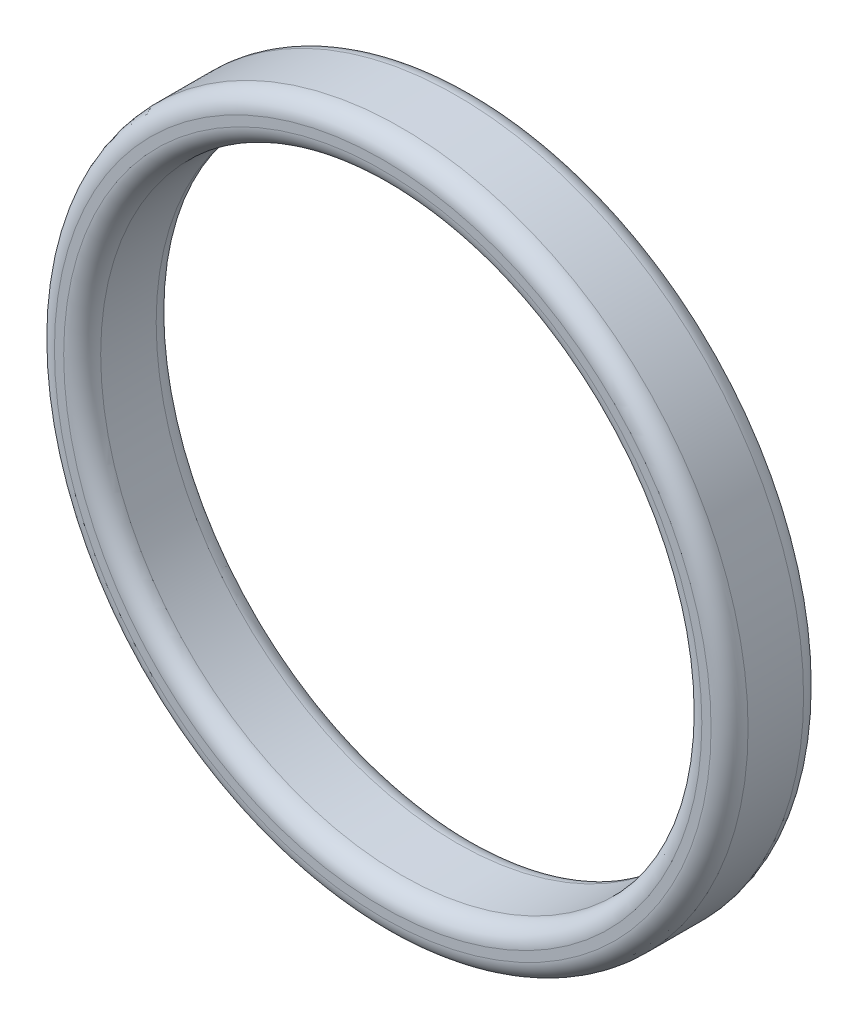
ISO-10303-21;
HEADER;
FILE_DESCRIPTION(('STEP AP214'),'2;1');
FILE_NAME('part.step','',(''),(''),'','','');
FILE_SCHEMA(('AUTOMOTIVE_DESIGN { 1 0 10303 214 1 1 1 1 }'));
ENDSEC;
DATA;
#1=APPLICATION_CONTEXT('core data for automotive mechanical design processes');
#2=APPLICATION_PROTOCOL_DEFINITION('international standard','automotive_design',2000,#1);
#3=PRODUCT_CONTEXT('',#1,'mechanical');
#4=PRODUCT('Part','Part','',(#3));
#5=PRODUCT_RELATED_PRODUCT_CATEGORY('part','',(#4));
#6=PRODUCT_DEFINITION_FORMATION('','',#4);
#7=PRODUCT_DEFINITION_CONTEXT('part definition',#1,'design');
#8=PRODUCT_DEFINITION('design','',#6,#7);
#9=PRODUCT_DEFINITION_SHAPE('','',#8);
#10=(LENGTH_UNIT() NAMED_UNIT(*) SI_UNIT(.MILLI.,.METRE.));
#11=(NAMED_UNIT(*) PLANE_ANGLE_UNIT() SI_UNIT($,.RADIAN.));
#12=(NAMED_UNIT(*) SI_UNIT($,.STERADIAN.) SOLID_ANGLE_UNIT());
#13=UNCERTAINTY_MEASURE_WITH_UNIT(LENGTH_MEASURE(1.E-05),#10,'distance_accuracy_value','');
#14=(GEOMETRIC_REPRESENTATION_CONTEXT(3) GLOBAL_UNCERTAINTY_ASSIGNED_CONTEXT((#13)) GLOBAL_UNIT_ASSIGNED_CONTEXT((#10,
#11,#12)) REPRESENTATION_CONTEXT('',''));
#15=CARTESIAN_POINT('',(0.,0.,0.));
#16=DIRECTION('',(0.,0.,1.));
#17=DIRECTION('',(1.,0.,0.));
#18=AXIS2_PLACEMENT_3D('',#15,#16,#17);
#19=CARTESIAN_POINT('',(0.,0.,0.02));
#20=DIRECTION('',(0.,0.,1.));
#21=DIRECTION('',(1.,0.,0.));
#22=AXIS2_PLACEMENT_3D('',#19,#20,#21);
#23=PLANE('',#22);
#24=CARTESIAN_POINT('',(0.,0.,0.02));
#25=DIRECTION('',(0.,0.,1.));
#26=DIRECTION('',(1.,0.,0.));
#27=AXIS2_PLACEMENT_3D('',#24,#25,#26);
#28=CIRCLE('',#27,0.138);
#29=CARTESIAN_POINT('',(0.138,0.,0.02));
#30=VERTEX_POINT('',#29);
#31=EDGE_CURVE('E60',#30,#30,#28,.F.);
#32=ORIENTED_EDGE('',*,*,#31,.T.);
#33=EDGE_LOOP('',(#32));
#34=FACE_BOUND('',#33,.T.);
#35=CARTESIAN_POINT('',(0.,0.,0.02));
#36=DIRECTION('',(0.,0.,1.));
#37=DIRECTION('',(1.,0.,0.));
#38=AXIS2_PLACEMENT_3D('',#35,#36,#37);
#39=CIRCLE('',#38,0.142);
#40=CARTESIAN_POINT('',(0.142,0.,0.02));
#41=VERTEX_POINT('',#40);
#42=EDGE_CURVE('E65',#41,#41,#39,.T.);
#43=ORIENTED_EDGE('',*,*,#42,.T.);
#44=EDGE_LOOP('',(#43));
#45=FACE_BOUND('',#44,.T.);
#46=ADVANCED_FACE('F47',(#34,#45),#23,.T.);
#47=CARTESIAN_POINT('',(0.,0.,-0.02));
#48=DIRECTION('',(0.,0.,1.));
#49=DIRECTION('',(1.,0.,0.));
#50=AXIS2_PLACEMENT_3D('',#47,#48,#49);
#51=PLANE('',#50);
#52=CARTESIAN_POINT('',(0.,0.,-0.02));
#53=DIRECTION('',(0.,0.,1.));
#54=DIRECTION('',(1.,0.,0.));
#55=AXIS2_PLACEMENT_3D('',#52,#53,#54);
#56=CIRCLE('',#55,0.138);
#57=CARTESIAN_POINT('',(0.138,0.,-0.02));
#58=VERTEX_POINT('',#57);
#59=EDGE_CURVE('E79',#58,#58,#56,.T.);
#60=ORIENTED_EDGE('',*,*,#59,.T.);
#61=EDGE_LOOP('',(#60));
#62=FACE_BOUND('',#61,.T.);
#63=CARTESIAN_POINT('',(0.,0.,-0.02));
#64=DIRECTION('',(0.,0.,1.));
#65=DIRECTION('',(1.,0.,0.));
#66=AXIS2_PLACEMENT_3D('',#63,#64,#65);
#67=CIRCLE('',#66,0.142);
#68=CARTESIAN_POINT('',(0.142,0.,-0.02));
#69=VERTEX_POINT('',#68);
#70=EDGE_CURVE('E83',#69,#69,#67,.F.);
#71=ORIENTED_EDGE('',*,*,#70,.T.);
#72=EDGE_LOOP('',(#71));
#73=FACE_BOUND('',#72,.T.);
#74=ADVANCED_FACE('F88',(#62,#73),#51,.F.);
#75=CARTESIAN_POINT('',(0.,0.,0.02));
#76=DIRECTION('',(0.,0.,-1.));
#77=DIRECTION('',(-1.,0.,0.));
#78=AXIS2_PLACEMENT_3D('',#75,#76,#77);
#79=CYLINDRICAL_SURFACE('',#78,0.15);
#80=CARTESIAN_POINT('',(0.,0.,-0.012));
#81=DIRECTION('',(0.,0.,1.));
#82=DIRECTION('',(1.,0.,0.));
#83=AXIS2_PLACEMENT_3D('',#80,#81,#82);
#84=CIRCLE('',#83,0.15);
#85=CARTESIAN_POINT('',(0.15,0.,-0.012));
#86=VERTEX_POINT('',#85);
#87=EDGE_CURVE('E11',#86,#86,#84,.T.);
#88=ORIENTED_EDGE('',*,*,#87,.T.);
#89=EDGE_LOOP('',(#88));
#90=FACE_BOUND('',#89,.T.);
#91=CARTESIAN_POINT('',(0.,0.,0.012));
#92=DIRECTION('',(0.,0.,1.));
#93=DIRECTION('',(1.,0.,0.));
#94=AXIS2_PLACEMENT_3D('',#91,#92,#93);
#95=CIRCLE('',#94,0.15);
#96=CARTESIAN_POINT('',(0.15,0.,0.012));
#97=VERTEX_POINT('',#96);
#98=EDGE_CURVE('E55',#97,#97,#95,.F.);
#99=ORIENTED_EDGE('',*,*,#98,.T.);
#100=EDGE_LOOP('',(#99));
#101=FACE_BOUND('',#100,.T.);
#102=ADVANCED_FACE('F108',(#90,#101),#79,.T.);
#103=CARTESIAN_POINT('',(0.,0.,0.02));
#104=DIRECTION('',(0.,0.,-1.));
#105=DIRECTION('',(-1.,0.,0.));
#106=AXIS2_PLACEMENT_3D('',#103,#104,#105);
#107=CYLINDRICAL_SURFACE('',#106,0.13);
#108=CARTESIAN_POINT('',(0.,0.,-0.012));
#109=DIRECTION('',(0.,0.,1.));
#110=DIRECTION('',(1.,0.,0.));
#111=AXIS2_PLACEMENT_3D('',#108,#109,#110);
#112=CIRCLE('',#111,0.13);
#113=CARTESIAN_POINT('',(0.13,0.,-0.012));
#114=VERTEX_POINT('',#113);
#115=EDGE_CURVE('E71',#114,#114,#112,.F.);
#116=ORIENTED_EDGE('',*,*,#115,.T.);
#117=EDGE_LOOP('',(#116));
#118=FACE_BOUND('',#117,.T.);
#119=CARTESIAN_POINT('',(0.,0.,0.012));
#120=DIRECTION('',(0.,0.,1.));
#121=DIRECTION('',(1.,0.,0.));
#122=AXIS2_PLACEMENT_3D('',#119,#120,#121);
#123=CIRCLE('',#122,0.13);
#124=CARTESIAN_POINT('',(0.13,0.,0.012));
#125=VERTEX_POINT('',#124);
#126=EDGE_CURVE('E75',#125,#125,#123,.T.);
#127=ORIENTED_EDGE('',*,*,#126,.T.);
#128=EDGE_LOOP('',(#127));
#129=FACE_BOUND('',#128,.T.);
#130=ADVANCED_FACE('F113',(#118,#129),#107,.F.);
#131=CARTESIAN_POINT('',(0.,0.,-0.012));
#132=DIRECTION('',(0.,0.,1.));
#133=DIRECTION('',(1.,0.,0.));
#134=AXIS2_PLACEMENT_3D('',#131,#132,#133);
#135=TOROIDAL_SURFACE('',#134,0.138,0.008);
#136=ORIENTED_EDGE('',*,*,#115,.F.);
#137=EDGE_LOOP('',(#136));
#138=FACE_BOUND('',#137,.T.);
#139=ORIENTED_EDGE('',*,*,#59,.F.);
#140=EDGE_LOOP('',(#139));
#141=FACE_BOUND('',#140,.T.);
#142=ADVANCED_FACE('F99',(#138,#141),#135,.T.);
#143=CARTESIAN_POINT('',(0.,0.,0.012));
#144=DIRECTION('',(0.,0.,1.));
#145=DIRECTION('',(1.,0.,0.));
#146=AXIS2_PLACEMENT_3D('',#143,#144,#145);
#147=TOROIDAL_SURFACE('',#146,0.138,0.008);
#148=ORIENTED_EDGE('',*,*,#31,.F.);
#149=EDGE_LOOP('',(#148));
#150=FACE_BOUND('',#149,.T.);
#151=ORIENTED_EDGE('',*,*,#126,.F.);
#152=EDGE_LOOP('',(#151));
#153=FACE_BOUND('',#152,.T.);
#154=ADVANCED_FACE('F93',(#150,#153),#147,.T.);
#155=CARTESIAN_POINT('',(0.,0.,-0.012));
#156=DIRECTION('',(0.,0.,1.));
#157=DIRECTION('',(1.,0.,0.));
#158=AXIS2_PLACEMENT_3D('',#155,#156,#157);
#159=TOROIDAL_SURFACE('',#158,0.142,0.008);
#160=ORIENTED_EDGE('',*,*,#70,.F.);
#161=EDGE_LOOP('',(#160));
#162=FACE_BOUND('',#161,.T.);
#163=ORIENTED_EDGE('',*,*,#87,.F.);
#164=EDGE_LOOP('',(#163));
#165=FACE_BOUND('',#164,.T.);
#166=ADVANCED_FACE('F90',(#162,#165),#159,.T.);
#167=CARTESIAN_POINT('',(0.,0.,0.012));
#168=DIRECTION('',(0.,0.,1.));
#169=DIRECTION('',(1.,0.,0.));
#170=AXIS2_PLACEMENT_3D('',#167,#168,#169);
#171=TOROIDAL_SURFACE('',#170,0.142,0.008);
#172=ORIENTED_EDGE('',*,*,#98,.F.);
#173=EDGE_LOOP('',(#172));
#174=FACE_BOUND('',#173,.T.);
#175=ORIENTED_EDGE('',*,*,#42,.F.);
#176=EDGE_LOOP('',(#175));
#177=FACE_BOUND('',#176,.T.);
#178=ADVANCED_FACE('F49',(#174,#177),#171,.T.);
#179=CLOSED_SHELL('',(#46,#74,#102,#130,#142,#154,#166,#178));
#180=MANIFOLD_SOLID_BREP('B2',#179);
#181=ADVANCED_BREP_SHAPE_REPRESENTATION('',(#18,#180),#14);
#182=SHAPE_DEFINITION_REPRESENTATION(#9,#181);
ENDSEC;
END-ISO-10303-21;
